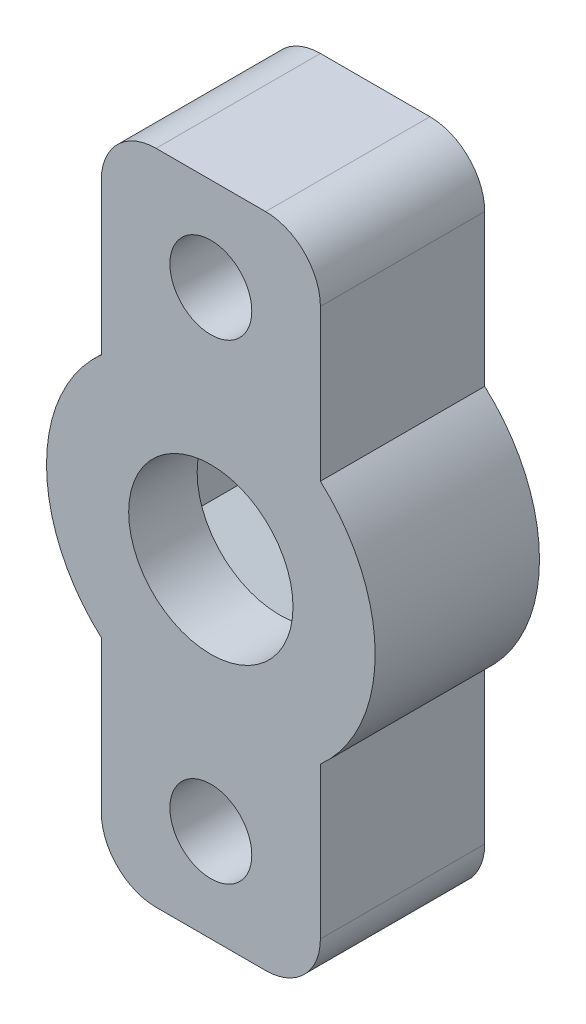
ISO-10303-21;
HEADER;
FILE_DESCRIPTION(('STEP AP214'),'2;1');
FILE_NAME('part.step','',(''),(''),'','','');
FILE_SCHEMA(('AUTOMOTIVE_DESIGN { 1 0 10303 214 1 1 1 1 }'));
ENDSEC;
DATA;
#1=APPLICATION_CONTEXT('core data for automotive mechanical design processes');
#2=APPLICATION_PROTOCOL_DEFINITION('international standard','automotive_design',2000,#1);
#3=PRODUCT_CONTEXT('',#1,'mechanical');
#4=PRODUCT('Part','Part','',(#3));
#5=PRODUCT_RELATED_PRODUCT_CATEGORY('part','',(#4));
#6=PRODUCT_DEFINITION_FORMATION('','',#4);
#7=PRODUCT_DEFINITION_CONTEXT('part definition',#1,'design');
#8=PRODUCT_DEFINITION('design','',#6,#7);
#9=PRODUCT_DEFINITION_SHAPE('','',#8);
#10=(LENGTH_UNIT() NAMED_UNIT(*) SI_UNIT(.MILLI.,.METRE.));
#11=(NAMED_UNIT(*) PLANE_ANGLE_UNIT() SI_UNIT($,.RADIAN.));
#12=(NAMED_UNIT(*) SI_UNIT($,.STERADIAN.) SOLID_ANGLE_UNIT());
#13=UNCERTAINTY_MEASURE_WITH_UNIT(LENGTH_MEASURE(1.E-05),#10,'distance_accuracy_value','');
#14=(GEOMETRIC_REPRESENTATION_CONTEXT(3) GLOBAL_UNCERTAINTY_ASSIGNED_CONTEXT((#13)) GLOBAL_UNIT_ASSIGNED_CONTEXT((#10,
#11,#12)) REPRESENTATION_CONTEXT('',''));
#15=CARTESIAN_POINT('',(0.,0.,0.));
#16=DIRECTION('',(0.,0.,1.));
#17=DIRECTION('',(1.,0.,0.));
#18=AXIS2_PLACEMENT_3D('',#15,#16,#17);
#19=CARTESIAN_POINT('',(2.54,12.7,7.62));
#20=DIRECTION('',(0.,0.,-1.));
#21=DIRECTION('',(-1.,0.,0.));
#22=AXIS2_PLACEMENT_3D('',#19,#20,#21);
#23=CYLINDRICAL_SURFACE('',#22,2.54);
#24=CARTESIAN_POINT('',(2.54,12.7,0.));
#25=DIRECTION('',(0.,0.,1.));
#26=DIRECTION('',(1.,0.,0.));
#27=AXIS2_PLACEMENT_3D('',#24,#25,#26);
#28=CIRCLE('',#27,2.54);
#29=CARTESIAN_POINT('',(5.08,12.7,0.));
#30=VERTEX_POINT('',#29);
#31=CARTESIAN_POINT('',(2.53999999999998,15.24,0.));
#32=VERTEX_POINT('',#31);
#33=EDGE_CURVE('E175',#30,#32,#28,.T.);
#34=ORIENTED_EDGE('',*,*,#33,.T.);
#35=DIRECTION('',(0.,0.,-1.));
#36=VECTOR('',#35,1.);
#37=CARTESIAN_POINT('',(2.53999999999998,15.24,7.62));
#38=LINE('',#37,#36);
#39=CARTESIAN_POINT('',(2.53999999999998,15.24,7.62));
#40=VERTEX_POINT('',#39);
#41=EDGE_CURVE('E11',#40,#32,#38,.T.);
#42=ORIENTED_EDGE('',*,*,#41,.F.);
#43=CARTESIAN_POINT('',(2.54,12.7,7.62));
#44=DIRECTION('',(0.,0.,1.));
#45=DIRECTION('',(1.,0.,0.));
#46=AXIS2_PLACEMENT_3D('',#43,#44,#45);
#47=CIRCLE('',#46,2.54);
#48=CARTESIAN_POINT('',(5.08,12.7,7.62));
#49=VERTEX_POINT('',#48);
#50=EDGE_CURVE('E211',#49,#40,#47,.T.);
#51=ORIENTED_EDGE('',*,*,#50,.F.);
#52=DIRECTION('',(0.,0.,-1.));
#53=VECTOR('',#52,1.);
#54=CARTESIAN_POINT('',(5.08,12.7,7.62));
#55=LINE('',#54,#53);
#56=EDGE_CURVE('E171',#49,#30,#55,.T.);
#57=ORIENTED_EDGE('',*,*,#56,.T.);
#58=EDGE_LOOP('',(#34,#42,#51,#57));
#59=FACE_BOUND('',#58,.T.);
#60=ADVANCED_FACE('F38',(#59),#23,.T.);
#61=CARTESIAN_POINT('',(-2.53999999999998,15.24,7.62));
#62=DIRECTION('',(0.,-1.,0.));
#63=DIRECTION('',(0.,0.,-1.));
#64=AXIS2_PLACEMENT_3D('',#61,#62,#63);
#65=PLANE('',#64);
#66=DIRECTION('',(-1.,0.,0.));
#67=VECTOR('',#66,1.);
#68=CARTESIAN_POINT('',(-2.53999999999998,15.24,0.));
#69=LINE('',#68,#67);
#70=CARTESIAN_POINT('',(-2.53999999999998,15.24,0.));
#71=VERTEX_POINT('',#70);
#72=EDGE_CURVE('E179',#32,#71,#69,.T.);
#73=ORIENTED_EDGE('',*,*,#72,.T.);
#74=DIRECTION('',(0.,0.,-1.));
#75=VECTOR('',#74,1.);
#76=CARTESIAN_POINT('',(-2.53999999999998,15.24,7.62));
#77=LINE('',#76,#75);
#78=CARTESIAN_POINT('',(-2.53999999999998,15.24,7.62));
#79=VERTEX_POINT('',#78);
#80=EDGE_CURVE('E46',#79,#71,#77,.T.);
#81=ORIENTED_EDGE('',*,*,#80,.F.);
#82=DIRECTION('',(-1.,0.,0.));
#83=VECTOR('',#82,1.);
#84=CARTESIAN_POINT('',(-2.53999999999998,15.24,7.62));
#85=LINE('',#84,#83);
#86=EDGE_CURVE('E115',#40,#79,#85,.T.);
#87=ORIENTED_EDGE('',*,*,#86,.F.);
#88=ORIENTED_EDGE('',*,*,#41,.T.);
#89=EDGE_LOOP('',(#73,#81,#87,#88));
#90=FACE_BOUND('',#89,.T.);
#91=ADVANCED_FACE('F456',(#90),#65,.F.);
#92=CARTESIAN_POINT('',(-2.54,12.7,7.62));
#93=DIRECTION('',(0.,0.,-1.));
#94=DIRECTION('',(-1.,0.,0.));
#95=AXIS2_PLACEMENT_3D('',#92,#93,#94);
#96=CYLINDRICAL_SURFACE('',#95,2.54);
#97=CARTESIAN_POINT('',(-2.54,12.7,0.));
#98=DIRECTION('',(0.,0.,1.));
#99=DIRECTION('',(1.,0.,0.));
#100=AXIS2_PLACEMENT_3D('',#97,#98,#99);
#101=CIRCLE('',#100,2.54);
#102=CARTESIAN_POINT('',(-5.08,12.7,0.));
#103=VERTEX_POINT('',#102);
#104=EDGE_CURVE('E183',#71,#103,#101,.T.);
#105=ORIENTED_EDGE('',*,*,#104,.T.);
#106=DIRECTION('',(0.,0.,-1.));
#107=VECTOR('',#106,1.);
#108=CARTESIAN_POINT('',(-5.08,12.7,7.62));
#109=LINE('',#108,#107);
#110=CARTESIAN_POINT('',(-5.08,12.7,7.62));
#111=VERTEX_POINT('',#110);
#112=EDGE_CURVE('E238',#111,#103,#109,.T.);
#113=ORIENTED_EDGE('',*,*,#112,.F.);
#114=CARTESIAN_POINT('',(-2.54,12.7,7.62));
#115=DIRECTION('',(0.,0.,1.));
#116=DIRECTION('',(1.,0.,0.));
#117=AXIS2_PLACEMENT_3D('',#114,#115,#116);
#118=CIRCLE('',#117,2.54);
#119=EDGE_CURVE('E248',#79,#111,#118,.T.);
#120=ORIENTED_EDGE('',*,*,#119,.F.);
#121=ORIENTED_EDGE('',*,*,#80,.T.);
#122=EDGE_LOOP('',(#105,#113,#120,#121));
#123=FACE_BOUND('',#122,.T.);
#124=ADVANCED_FACE('F246',(#123),#96,.T.);
#125=CARTESIAN_POINT('',(-5.08,12.7,7.62));
#126=DIRECTION('',(1.,0.,0.));
#127=DIRECTION('',(0.,1.,0.));
#128=AXIS2_PLACEMENT_3D('',#125,#126,#127);
#129=PLANE('',#128);
#130=DIRECTION('',(0.,-1.,0.));
#131=VECTOR('',#130,1.);
#132=CARTESIAN_POINT('',(-5.08,12.7,0.));
#133=LINE('',#132,#131);
#134=CARTESIAN_POINT('',(-5.08,5.67961266284947,0.));
#135=VERTEX_POINT('',#134);
#136=EDGE_CURVE('E186',#103,#135,#133,.T.);
#137=ORIENTED_EDGE('',*,*,#136,.T.);
#138=DIRECTION('',(0.,0.,-1.));
#139=VECTOR('',#138,1.);
#140=CARTESIAN_POINT('',(-5.08,5.67961266284947,7.62));
#141=LINE('',#140,#139);
#142=CARTESIAN_POINT('',(-5.08,5.67961266284947,7.62));
#143=VERTEX_POINT('',#142);
#144=EDGE_CURVE('E234',#143,#135,#141,.T.);
#145=ORIENTED_EDGE('',*,*,#144,.F.);
#146=DIRECTION('',(0.,-1.,0.));
#147=VECTOR('',#146,1.);
#148=CARTESIAN_POINT('',(-5.08,12.7,7.62));
#149=LINE('',#148,#147);
#150=EDGE_CURVE('E267',#111,#143,#149,.T.);
#151=ORIENTED_EDGE('',*,*,#150,.F.);
#152=ORIENTED_EDGE('',*,*,#112,.T.);
#153=EDGE_LOOP('',(#137,#145,#151,#152));
#154=FACE_BOUND('',#153,.T.);
#155=ADVANCED_FACE('F257',(#154),#129,.F.);
#156=CARTESIAN_POINT('',(0.,0.,7.62));
#157=DIRECTION('',(0.,0.,-1.));
#158=DIRECTION('',(-1.,0.,0.));
#159=AXIS2_PLACEMENT_3D('',#156,#157,#158);
#160=CYLINDRICAL_SURFACE('',#159,7.62);
#161=CARTESIAN_POINT('',(0.,0.,0.));
#162=DIRECTION('',(0.,0.,1.));
#163=DIRECTION('',(1.,0.,0.));
#164=AXIS2_PLACEMENT_3D('',#161,#162,#163);
#165=CIRCLE('',#164,7.62);
#166=CARTESIAN_POINT('',(-5.07999999999999,-5.67961266284947,0.));
#167=VERTEX_POINT('',#166);
#168=EDGE_CURVE('E189',#135,#167,#165,.T.);
#169=ORIENTED_EDGE('',*,*,#168,.T.);
#170=DIRECTION('',(0.,0.,-1.));
#171=VECTOR('',#170,1.);
#172=CARTESIAN_POINT('',(-5.07999999999999,-5.67961266284947,7.62));
#173=LINE('',#172,#171);
#174=CARTESIAN_POINT('',(-5.07999999999999,-5.67961266284947,7.62));
#175=VERTEX_POINT('',#174);
#176=EDGE_CURVE('E230',#175,#167,#173,.T.);
#177=ORIENTED_EDGE('',*,*,#176,.F.);
#178=CARTESIAN_POINT('',(0.,0.,7.62));
#179=DIRECTION('',(0.,0.,1.));
#180=DIRECTION('',(1.,0.,0.));
#181=AXIS2_PLACEMENT_3D('',#178,#179,#180);
#182=CIRCLE('',#181,7.62);
#183=EDGE_CURVE('E263',#143,#175,#182,.T.);
#184=ORIENTED_EDGE('',*,*,#183,.F.);
#185=ORIENTED_EDGE('',*,*,#144,.T.);
#186=EDGE_LOOP('',(#169,#177,#184,#185));
#187=FACE_BOUND('',#186,.T.);
#188=ADVANCED_FACE('F261',(#187),#160,.T.);
#189=CARTESIAN_POINT('',(-5.08,-12.7,7.62));
#190=DIRECTION('',(1.,0.,0.));
#191=DIRECTION('',(0.,1.,0.));
#192=AXIS2_PLACEMENT_3D('',#189,#190,#191);
#193=PLANE('',#192);
#194=DIRECTION('',(0.,-1.,0.));
#195=VECTOR('',#194,1.);
#196=CARTESIAN_POINT('',(-5.08,-12.7,0.));
#197=LINE('',#196,#195);
#198=CARTESIAN_POINT('',(-5.08,-12.7,0.));
#199=VERTEX_POINT('',#198);
#200=EDGE_CURVE('E192',#167,#199,#197,.T.);
#201=ORIENTED_EDGE('',*,*,#200,.T.);
#202=DIRECTION('',(0.,0.,-1.));
#203=VECTOR('',#202,1.);
#204=CARTESIAN_POINT('',(-5.08,-12.7,7.62));
#205=LINE('',#204,#203);
#206=CARTESIAN_POINT('',(-5.08,-12.7,7.62));
#207=VERTEX_POINT('',#206);
#208=EDGE_CURVE('E226',#207,#199,#205,.T.);
#209=ORIENTED_EDGE('',*,*,#208,.F.);
#210=DIRECTION('',(0.,-1.,0.));
#211=VECTOR('',#210,1.);
#212=CARTESIAN_POINT('',(-5.08,-12.7,7.62));
#213=LINE('',#212,#211);
#214=EDGE_CURVE('E266',#175,#207,#213,.T.);
#215=ORIENTED_EDGE('',*,*,#214,.F.);
#216=ORIENTED_EDGE('',*,*,#176,.T.);
#217=EDGE_LOOP('',(#201,#209,#215,#216));
#218=FACE_BOUND('',#217,.T.);
#219=ADVANCED_FACE('F469',(#218),#193,.F.);
#220=CARTESIAN_POINT('',(-2.54,-12.7,7.62));
#221=DIRECTION('',(0.,0.,-1.));
#222=DIRECTION('',(-1.,0.,0.));
#223=AXIS2_PLACEMENT_3D('',#220,#221,#222);
#224=CYLINDRICAL_SURFACE('',#223,2.54);
#225=CARTESIAN_POINT('',(-2.54,-12.7,0.));
#226=DIRECTION('',(0.,0.,1.));
#227=DIRECTION('',(-1.,0.,0.));
#228=AXIS2_PLACEMENT_3D('',#225,#226,#227);
#229=CIRCLE('',#228,2.54);
#230=CARTESIAN_POINT('',(-2.53999999999998,-15.24,0.));
#231=VERTEX_POINT('',#230);
#232=EDGE_CURVE('E195',#199,#231,#229,.T.);
#233=ORIENTED_EDGE('',*,*,#232,.T.);
#234=DIRECTION('',(0.,0.,-1.));
#235=VECTOR('',#234,1.);
#236=CARTESIAN_POINT('',(-2.53999999999998,-15.24,7.62));
#237=LINE('',#236,#235);
#238=CARTESIAN_POINT('',(-2.53999999999998,-15.24,7.62));
#239=VERTEX_POINT('',#238);
#240=EDGE_CURVE('E222',#239,#231,#237,.T.);
#241=ORIENTED_EDGE('',*,*,#240,.F.);
#242=CARTESIAN_POINT('',(-2.54,-12.7,7.62));
#243=DIRECTION('',(0.,0.,1.));
#244=DIRECTION('',(-1.,0.,0.));
#245=AXIS2_PLACEMENT_3D('',#242,#243,#244);
#246=CIRCLE('',#245,2.54);
#247=EDGE_CURVE('E271',#207,#239,#246,.T.);
#248=ORIENTED_EDGE('',*,*,#247,.F.);
#249=ORIENTED_EDGE('',*,*,#208,.T.);
#250=EDGE_LOOP('',(#233,#241,#248,#249));
#251=FACE_BOUND('',#250,.T.);
#252=ADVANCED_FACE('F472',(#251),#224,.T.);
#253=CARTESIAN_POINT('',(-2.53999999999998,-15.24,7.62));
#254=DIRECTION('',(0.,1.,0.));
#255=DIRECTION('',(0.,0.,1.));
#256=AXIS2_PLACEMENT_3D('',#253,#254,#255);
#257=PLANE('',#256);
#258=DIRECTION('',(1.,0.,0.));
#259=VECTOR('',#258,1.);
#260=CARTESIAN_POINT('',(-2.53999999999998,-15.24,0.));
#261=LINE('',#260,#259);
#262=CARTESIAN_POINT('',(2.53999999999998,-15.24,0.));
#263=VERTEX_POINT('',#262);
#264=EDGE_CURVE('E198',#231,#263,#261,.T.);
#265=ORIENTED_EDGE('',*,*,#264,.T.);
#266=DIRECTION('',(0.,0.,-1.));
#267=VECTOR('',#266,1.);
#268=CARTESIAN_POINT('',(2.53999999999998,-15.24,7.62));
#269=LINE('',#268,#267);
#270=CARTESIAN_POINT('',(2.53999999999998,-15.24,7.62));
#271=VERTEX_POINT('',#270);
#272=EDGE_CURVE('E218',#271,#263,#269,.T.);
#273=ORIENTED_EDGE('',*,*,#272,.F.);
#274=DIRECTION('',(1.,0.,0.));
#275=VECTOR('',#274,1.);
#276=CARTESIAN_POINT('',(-2.53999999999998,-15.24,7.62));
#277=LINE('',#276,#275);
#278=EDGE_CURVE('E278',#239,#271,#277,.T.);
#279=ORIENTED_EDGE('',*,*,#278,.F.);
#280=ORIENTED_EDGE('',*,*,#240,.T.);
#281=EDGE_LOOP('',(#265,#273,#279,#280));
#282=FACE_BOUND('',#281,.T.);
#283=ADVANCED_FACE('F286',(#282),#257,.F.);
#284=CARTESIAN_POINT('',(2.54,-12.7,7.62));
#285=DIRECTION('',(0.,0.,-1.));
#286=DIRECTION('',(-1.,0.,0.));
#287=AXIS2_PLACEMENT_3D('',#284,#285,#286);
#288=CYLINDRICAL_SURFACE('',#287,2.54);
#289=CARTESIAN_POINT('',(2.54,-12.7,0.));
#290=DIRECTION('',(0.,0.,1.));
#291=DIRECTION('',(-1.,0.,0.));
#292=AXIS2_PLACEMENT_3D('',#289,#290,#291);
#293=CIRCLE('',#292,2.54);
#294=CARTESIAN_POINT('',(5.08,-12.7,0.));
#295=VERTEX_POINT('',#294);
#296=EDGE_CURVE('E201',#263,#295,#293,.T.);
#297=ORIENTED_EDGE('',*,*,#296,.T.);
#298=DIRECTION('',(0.,0.,-1.));
#299=VECTOR('',#298,1.);
#300=CARTESIAN_POINT('',(5.08,-12.7,7.62));
#301=LINE('',#300,#299);
#302=CARTESIAN_POINT('',(5.08,-12.7,7.62));
#303=VERTEX_POINT('',#302);
#304=EDGE_CURVE('E164',#303,#295,#301,.T.);
#305=ORIENTED_EDGE('',*,*,#304,.F.);
#306=CARTESIAN_POINT('',(2.54,-12.7,7.62));
#307=DIRECTION('',(0.,0.,1.));
#308=DIRECTION('',(-1.,0.,0.));
#309=AXIS2_PLACEMENT_3D('',#306,#307,#308);
#310=CIRCLE('',#309,2.54);
#311=EDGE_CURVE('E150',#271,#303,#310,.T.);
#312=ORIENTED_EDGE('',*,*,#311,.F.);
#313=ORIENTED_EDGE('',*,*,#272,.T.);
#314=EDGE_LOOP('',(#297,#305,#312,#313));
#315=FACE_BOUND('',#314,.T.);
#316=ADVANCED_FACE('F290',(#315),#288,.T.);
#317=CARTESIAN_POINT('',(5.08,-12.7,7.62));
#318=DIRECTION('',(-1.,0.,0.));
#319=DIRECTION('',(0.,-1.,0.));
#320=AXIS2_PLACEMENT_3D('',#317,#318,#319);
#321=PLANE('',#320);
#322=DIRECTION('',(0.,1.,0.));
#323=VECTOR('',#322,1.);
#324=CARTESIAN_POINT('',(5.08,-12.7,0.));
#325=LINE('',#324,#323);
#326=CARTESIAN_POINT('',(5.08,-5.67961266284946,0.));
#327=VERTEX_POINT('',#326);
#328=EDGE_CURVE('E160',#295,#327,#325,.T.);
#329=ORIENTED_EDGE('',*,*,#328,.T.);
#330=DIRECTION('',(0.,0.,-1.));
#331=VECTOR('',#330,1.);
#332=CARTESIAN_POINT('',(5.08,-5.67961266284946,7.62));
#333=LINE('',#332,#331);
#334=CARTESIAN_POINT('',(5.08,-5.67961266284946,7.62));
#335=VERTEX_POINT('',#334);
#336=EDGE_CURVE('E157',#335,#327,#333,.T.);
#337=ORIENTED_EDGE('',*,*,#336,.F.);
#338=DIRECTION('',(0.,1.,0.));
#339=VECTOR('',#338,1.);
#340=CARTESIAN_POINT('',(5.08,-12.7,7.62));
#341=LINE('',#340,#339);
#342=EDGE_CURVE('E143',#303,#335,#341,.T.);
#343=ORIENTED_EDGE('',*,*,#342,.F.);
#344=ORIENTED_EDGE('',*,*,#304,.T.);
#345=EDGE_LOOP('',(#329,#337,#343,#344));
#346=FACE_BOUND('',#345,.T.);
#347=ADVANCED_FACE('F158',(#346),#321,.F.);
#348=CARTESIAN_POINT('',(0.,0.,7.62));
#349=DIRECTION('',(0.,0.,-1.));
#350=DIRECTION('',(-1.,0.,0.));
#351=AXIS2_PLACEMENT_3D('',#348,#349,#350);
#352=CYLINDRICAL_SURFACE('',#351,7.62);
#353=CARTESIAN_POINT('',(0.,0.,0.));
#354=DIRECTION('',(0.,0.,1.));
#355=DIRECTION('',(1.,0.,0.));
#356=AXIS2_PLACEMENT_3D('',#353,#354,#355);
#357=CIRCLE('',#356,7.62);
#358=CARTESIAN_POINT('',(5.08,5.67961266284946,0.));
#359=VERTEX_POINT('',#358);
#360=EDGE_CURVE('E206',#327,#359,#357,.T.);
#361=ORIENTED_EDGE('',*,*,#360,.T.);
#362=DIRECTION('',(0.,0.,-1.));
#363=VECTOR('',#362,1.);
#364=CARTESIAN_POINT('',(5.08,5.67961266284946,7.62));
#365=LINE('',#364,#363);
#366=CARTESIAN_POINT('',(5.08,5.67961266284946,7.62));
#367=VERTEX_POINT('',#366);
#368=EDGE_CURVE('E165',#367,#359,#365,.T.);
#369=ORIENTED_EDGE('',*,*,#368,.F.);
#370=CARTESIAN_POINT('',(0.,0.,7.62));
#371=DIRECTION('',(0.,0.,1.));
#372=DIRECTION('',(1.,0.,0.));
#373=AXIS2_PLACEMENT_3D('',#370,#371,#372);
#374=CIRCLE('',#373,7.62);
#375=EDGE_CURVE('E147',#335,#367,#374,.T.);
#376=ORIENTED_EDGE('',*,*,#375,.F.);
#377=ORIENTED_EDGE('',*,*,#336,.T.);
#378=EDGE_LOOP('',(#361,#369,#376,#377));
#379=FACE_BOUND('',#378,.T.);
#380=ADVANCED_FACE('F167',(#379),#352,.T.);
#381=CARTESIAN_POINT('',(5.08,12.7,7.62));
#382=DIRECTION('',(-1.,0.,0.));
#383=DIRECTION('',(0.,-1.,0.));
#384=AXIS2_PLACEMENT_3D('',#381,#382,#383);
#385=PLANE('',#384);
#386=DIRECTION('',(0.,1.,0.));
#387=VECTOR('',#386,1.);
#388=CARTESIAN_POINT('',(5.08,12.7,0.));
#389=LINE('',#388,#387);
#390=EDGE_CURVE('E107',#359,#30,#389,.T.);
#391=ORIENTED_EDGE('',*,*,#390,.T.);
#392=ORIENTED_EDGE('',*,*,#56,.F.);
#393=DIRECTION('',(0.,1.,0.));
#394=VECTOR('',#393,1.);
#395=CARTESIAN_POINT('',(5.08,12.7,7.62));
#396=LINE('',#395,#394);
#397=EDGE_CURVE('E62',#367,#49,#396,.T.);
#398=ORIENTED_EDGE('',*,*,#397,.F.);
#399=ORIENTED_EDGE('',*,*,#368,.T.);
#400=EDGE_LOOP('',(#391,#392,#398,#399));
#401=FACE_BOUND('',#400,.T.);
#402=ADVANCED_FACE('F291',(#401),#385,.F.);
#403=CARTESIAN_POINT('',(2.54,12.7,7.62));
#404=DIRECTION('',(0.,0.,1.));
#405=DIRECTION('',(1.,0.,0.));
#406=AXIS2_PLACEMENT_3D('',#403,#404,#405);
#407=PLANE('',#406);
#408=CARTESIAN_POINT('',(0.,10.922,7.62));
#409=DIRECTION('',(0.,0.,1.));
#410=DIRECTION('',(1.,0.,0.));
#411=AXIS2_PLACEMENT_3D('',#408,#409,#410);
#412=CIRCLE('',#411,1.89865);
#413=CARTESIAN_POINT('',(1.89865,10.922,7.62));
#414=VERTEX_POINT('',#413);
#415=EDGE_CURVE('E384',#414,#414,#412,.T.);
#416=ORIENTED_EDGE('',*,*,#415,.F.);
#417=EDGE_LOOP('',(#416));
#418=FACE_BOUND('',#417,.T.);
#419=CARTESIAN_POINT('',(0.,-10.922,7.62));
#420=DIRECTION('',(0.,0.,1.));
#421=DIRECTION('',(1.,0.,0.));
#422=AXIS2_PLACEMENT_3D('',#419,#420,#421);
#423=CIRCLE('',#422,1.89865);
#424=CARTESIAN_POINT('',(1.89865,-10.922,7.62));
#425=VERTEX_POINT('',#424);
#426=EDGE_CURVE('E376',#425,#425,#423,.T.);
#427=ORIENTED_EDGE('',*,*,#426,.F.);
#428=EDGE_LOOP('',(#427));
#429=FACE_BOUND('',#428,.T.);
#430=CARTESIAN_POINT('',(0.,0.,7.62));
#431=DIRECTION('',(0.,0.,1.));
#432=DIRECTION('',(1.,0.,0.));
#433=AXIS2_PLACEMENT_3D('',#430,#431,#432);
#434=CIRCLE('',#433,3.81);
#435=CARTESIAN_POINT('',(-3.81,0.,7.62));
#436=VERTEX_POINT('',#435);
#437=EDGE_CURVE('E346',#436,#436,#434,.T.);
#438=ORIENTED_EDGE('',*,*,#437,.F.);
#439=EDGE_LOOP('',(#438));
#440=FACE_BOUND('',#439,.T.);
#441=ORIENTED_EDGE('',*,*,#50,.T.);
#442=ORIENTED_EDGE('',*,*,#86,.T.);
#443=ORIENTED_EDGE('',*,*,#119,.T.);
#444=ORIENTED_EDGE('',*,*,#150,.T.);
#445=ORIENTED_EDGE('',*,*,#183,.T.);
#446=ORIENTED_EDGE('',*,*,#214,.T.);
#447=ORIENTED_EDGE('',*,*,#247,.T.);
#448=ORIENTED_EDGE('',*,*,#278,.T.);
#449=ORIENTED_EDGE('',*,*,#311,.T.);
#450=ORIENTED_EDGE('',*,*,#342,.T.);
#451=ORIENTED_EDGE('',*,*,#375,.T.);
#452=ORIENTED_EDGE('',*,*,#397,.T.);
#453=EDGE_LOOP('',(#441,#442,#443,#444,#445,#446,#447,#448,#449,#450,#451,#452));
#454=FACE_BOUND('',#453,.T.);
#455=ADVANCED_FACE('F145',(#418,#429,#440,#454),#407,.T.);
#456=CARTESIAN_POINT('',(2.54,12.7,0.));
#457=DIRECTION('',(0.,0.,1.));
#458=DIRECTION('',(1.,0.,0.));
#459=AXIS2_PLACEMENT_3D('',#456,#457,#458);
#460=PLANE('',#459);
#461=CARTESIAN_POINT('',(0.,10.922,0.));
#462=DIRECTION('',(0.,0.,-1.));
#463=DIRECTION('',(-1.,0.,0.));
#464=AXIS2_PLACEMENT_3D('',#461,#462,#463);
#465=CIRCLE('',#464,1.89865);
#466=CARTESIAN_POINT('',(-1.89865,10.922,0.));
#467=VERTEX_POINT('',#466);
#468=EDGE_CURVE('E388',#467,#467,#465,.T.);
#469=ORIENTED_EDGE('',*,*,#468,.F.);
#470=EDGE_LOOP('',(#469));
#471=FACE_BOUND('',#470,.T.);
#472=CARTESIAN_POINT('',(0.,-10.922,0.));
#473=DIRECTION('',(0.,0.,-1.));
#474=DIRECTION('',(-1.,0.,0.));
#475=AXIS2_PLACEMENT_3D('',#472,#473,#474);
#476=CIRCLE('',#475,1.89865);
#477=CARTESIAN_POINT('',(-1.89865,-10.922,0.));
#478=VERTEX_POINT('',#477);
#479=EDGE_CURVE('E380',#478,#478,#476,.T.);
#480=ORIENTED_EDGE('',*,*,#479,.F.);
#481=EDGE_LOOP('',(#480));
#482=FACE_BOUND('',#481,.T.);
#483=DIRECTION('',(0.866025403784439,0.499999999999999,0.));
#484=VECTOR('',#483,1.);
#485=CARTESIAN_POINT('',(-5.55625,3.20790243318486,0.));
#486=LINE('',#485,#484);
#487=CARTESIAN_POINT('',(-5.55625,3.20790243318486,0.));
#488=VERTEX_POINT('',#487);
#489=CARTESIAN_POINT('',(0.,6.41580486636971,0.));
#490=VERTEX_POINT('',#489);
#491=EDGE_CURVE('E340',#488,#490,#486,.T.);
#492=ORIENTED_EDGE('',*,*,#491,.F.);
#493=DIRECTION('',(0.,1.,0.));
#494=VECTOR('',#493,1.);
#495=CARTESIAN_POINT('',(-5.55625000000004,-3.20790243318479,0.));
#496=LINE('',#495,#494);
#497=CARTESIAN_POINT('',(-5.55625000000004,-3.20790243318479,0.));
#498=VERTEX_POINT('',#497);
#499=EDGE_CURVE('E53',#498,#488,#496,.T.);
#500=ORIENTED_EDGE('',*,*,#499,.F.);
#501=DIRECTION('',(-0.866025403784433,0.500000000000009,0.));
#502=VECTOR('',#501,1.);
#503=CARTESIAN_POINT('',(0.,-6.41580486636971,0.));
#504=LINE('',#503,#502);
#505=CARTESIAN_POINT('',(0.,-6.41580486636971,0.));
#506=VERTEX_POINT('',#505);
#507=EDGE_CURVE('E323',#506,#498,#504,.T.);
#508=ORIENTED_EDGE('',*,*,#507,.F.);
#509=DIRECTION('',(-0.866025403784443,-0.499999999999993,0.));
#510=VECTOR('',#509,1.);
#511=CARTESIAN_POINT('',(5.55624999999998,-3.2079024331849,0.));
#512=LINE('',#511,#510);
#513=CARTESIAN_POINT('',(5.55624999999998,-3.2079024331849,0.));
#514=VERTEX_POINT('',#513);
#515=EDGE_CURVE('E328',#514,#506,#512,.T.);
#516=ORIENTED_EDGE('',*,*,#515,.F.);
#517=DIRECTION('',(0.,-1.,0.));
#518=VECTOR('',#517,1.);
#519=CARTESIAN_POINT('',(5.55625000000001,3.20790243318483,0.));
#520=LINE('',#519,#518);
#521=CARTESIAN_POINT('',(5.55625000000001,3.20790243318483,0.));
#522=VERTEX_POINT('',#521);
#523=EDGE_CURVE('E332',#522,#514,#520,.T.);
#524=ORIENTED_EDGE('',*,*,#523,.F.);
#525=DIRECTION('',(0.866025403784437,-0.500000000000003,0.));
#526=VECTOR('',#525,1.);
#527=CARTESIAN_POINT('',(0.,6.41580486636971,0.));
#528=LINE('',#527,#526);
#529=EDGE_CURVE('E336',#490,#522,#528,.T.);
#530=ORIENTED_EDGE('',*,*,#529,.F.);
#531=EDGE_LOOP('',(#492,#500,#508,#516,#524,#530));
#532=FACE_BOUND('',#531,.T.);
#533=ORIENTED_EDGE('',*,*,#33,.F.);
#534=ORIENTED_EDGE('',*,*,#390,.F.);
#535=ORIENTED_EDGE('',*,*,#360,.F.);
#536=ORIENTED_EDGE('',*,*,#328,.F.);
#537=ORIENTED_EDGE('',*,*,#296,.F.);
#538=ORIENTED_EDGE('',*,*,#264,.F.);
#539=ORIENTED_EDGE('',*,*,#232,.F.);
#540=ORIENTED_EDGE('',*,*,#200,.F.);
#541=ORIENTED_EDGE('',*,*,#168,.F.);
#542=ORIENTED_EDGE('',*,*,#136,.F.);
#543=ORIENTED_EDGE('',*,*,#104,.F.);
#544=ORIENTED_EDGE('',*,*,#72,.F.);
#545=EDGE_LOOP('',(#533,#534,#535,#536,#537,#538,#539,#540,#541,#542,#543,#544));
#546=FACE_BOUND('',#545,.T.);
#547=ADVANCED_FACE('F252',(#471,#482,#532,#546),#460,.F.);
#548=CARTESIAN_POINT('',(-5.55625000000004,-3.20790243318479,4.445));
#549=DIRECTION('',(-1.,0.,0.));
#550=DIRECTION('',(0.,-1.,0.));
#551=AXIS2_PLACEMENT_3D('',#548,#549,#550);
#552=PLANE('',#551);
#553=ORIENTED_EDGE('',*,*,#499,.T.);
#554=DIRECTION('',(0.,0.,-1.));
#555=VECTOR('',#554,1.);
#556=CARTESIAN_POINT('',(-5.55625,3.20790243318486,4.445));
#557=LINE('',#556,#555);
#558=CARTESIAN_POINT('',(-5.55625,3.20790243318486,4.445));
#559=VERTEX_POINT('',#558);
#560=EDGE_CURVE('E300',#559,#488,#557,.T.);
#561=ORIENTED_EDGE('',*,*,#560,.F.);
#562=DIRECTION('',(0.,1.,0.));
#563=VECTOR('',#562,1.);
#564=CARTESIAN_POINT('',(-5.55625000000004,-3.20790243318479,4.445));
#565=LINE('',#564,#563);
#566=CARTESIAN_POINT('',(-5.55625000000004,-3.20790243318479,4.445));
#567=VERTEX_POINT('',#566);
#568=EDGE_CURVE('E327',#567,#559,#565,.T.);
#569=ORIENTED_EDGE('',*,*,#568,.F.);
#570=DIRECTION('',(0.,0.,-1.));
#571=VECTOR('',#570,1.);
#572=CARTESIAN_POINT('',(-5.55625000000004,-3.20790243318479,4.445));
#573=LINE('',#572,#571);
#574=EDGE_CURVE('E180',#567,#498,#573,.T.);
#575=ORIENTED_EDGE('',*,*,#574,.T.);
#576=EDGE_LOOP('',(#553,#561,#569,#575));
#577=FACE_BOUND('',#576,.T.);
#578=ADVANCED_FACE('F397',(#577),#552,.F.);
#579=CARTESIAN_POINT('',(0.,-6.41580486636971,4.445));
#580=DIRECTION('',(-0.500000000000009,-0.866025403784433,0.));
#581=DIRECTION('',(0.866025403784433,-0.500000000000009,0.));
#582=AXIS2_PLACEMENT_3D('',#579,#580,#581);
#583=PLANE('',#582);
#584=ORIENTED_EDGE('',*,*,#507,.T.);
#585=ORIENTED_EDGE('',*,*,#574,.F.);
#586=DIRECTION('',(-0.866025403784433,0.500000000000009,0.));
#587=VECTOR('',#586,1.);
#588=CARTESIAN_POINT('',(0.,-6.41580486636971,4.445));
#589=LINE('',#588,#587);
#590=CARTESIAN_POINT('',(0.,-6.41580486636971,4.445));
#591=VERTEX_POINT('',#590);
#592=EDGE_CURVE('E305',#591,#567,#589,.T.);
#593=ORIENTED_EDGE('',*,*,#592,.F.);
#594=DIRECTION('',(0.,0.,-1.));
#595=VECTOR('',#594,1.);
#596=CARTESIAN_POINT('',(0.,-6.41580486636971,4.445));
#597=LINE('',#596,#595);
#598=EDGE_CURVE('E317',#591,#506,#597,.T.);
#599=ORIENTED_EDGE('',*,*,#598,.T.);
#600=EDGE_LOOP('',(#584,#585,#593,#599));
#601=FACE_BOUND('',#600,.T.);
#602=ADVANCED_FACE('F438',(#601),#583,.F.);
#603=CARTESIAN_POINT('',(5.55624999999998,-3.2079024331849,4.445));
#604=DIRECTION('',(0.499999999999993,-0.866025403784443,0.));
#605=DIRECTION('',(0.866025403784443,0.499999999999993,0.));
#606=AXIS2_PLACEMENT_3D('',#603,#604,#605);
#607=PLANE('',#606);
#608=ORIENTED_EDGE('',*,*,#515,.T.);
#609=ORIENTED_EDGE('',*,*,#598,.F.);
#610=DIRECTION('',(-0.866025403784443,-0.499999999999993,0.));
#611=VECTOR('',#610,1.);
#612=CARTESIAN_POINT('',(5.55624999999998,-3.2079024331849,4.445));
#613=LINE('',#612,#611);
#614=CARTESIAN_POINT('',(5.55624999999998,-3.2079024331849,4.445));
#615=VERTEX_POINT('',#614);
#616=EDGE_CURVE('E350',#615,#591,#613,.T.);
#617=ORIENTED_EDGE('',*,*,#616,.F.);
#618=DIRECTION('',(0.,0.,-1.));
#619=VECTOR('',#618,1.);
#620=CARTESIAN_POINT('',(5.55624999999998,-3.2079024331849,4.445));
#621=LINE('',#620,#619);
#622=EDGE_CURVE('E313',#615,#514,#621,.T.);
#623=ORIENTED_EDGE('',*,*,#622,.T.);
#624=EDGE_LOOP('',(#608,#609,#617,#623));
#625=FACE_BOUND('',#624,.T.);
#626=ADVANCED_FACE('F442',(#625),#607,.F.);
#627=CARTESIAN_POINT('',(5.55625000000001,3.20790243318483,4.445));
#628=DIRECTION('',(1.,0.,0.));
#629=DIRECTION('',(0.,1.,0.));
#630=AXIS2_PLACEMENT_3D('',#627,#628,#629);
#631=PLANE('',#630);
#632=ORIENTED_EDGE('',*,*,#523,.T.);
#633=ORIENTED_EDGE('',*,*,#622,.F.);
#634=DIRECTION('',(0.,-1.,0.));
#635=VECTOR('',#634,1.);
#636=CARTESIAN_POINT('',(5.55625000000001,3.20790243318483,4.445));
#637=LINE('',#636,#635);
#638=CARTESIAN_POINT('',(5.55625000000001,3.20790243318483,4.445));
#639=VERTEX_POINT('',#638);
#640=EDGE_CURVE('E354',#639,#615,#637,.T.);
#641=ORIENTED_EDGE('',*,*,#640,.F.);
#642=DIRECTION('',(0.,0.,-1.));
#643=VECTOR('',#642,1.);
#644=CARTESIAN_POINT('',(5.55625000000001,3.20790243318483,4.445));
#645=LINE('',#644,#643);
#646=EDGE_CURVE('E309',#639,#522,#645,.T.);
#647=ORIENTED_EDGE('',*,*,#646,.T.);
#648=EDGE_LOOP('',(#632,#633,#641,#647));
#649=FACE_BOUND('',#648,.T.);
#650=ADVANCED_FACE('F445',(#649),#631,.F.);
#651=CARTESIAN_POINT('',(0.,6.41580486636971,4.445));
#652=DIRECTION('',(0.500000000000003,0.866025403784437,0.));
#653=DIRECTION('',(-0.866025403784437,0.500000000000003,0.));
#654=AXIS2_PLACEMENT_3D('',#651,#652,#653);
#655=PLANE('',#654);
#656=ORIENTED_EDGE('',*,*,#529,.T.);
#657=ORIENTED_EDGE('',*,*,#646,.F.);
#658=DIRECTION('',(0.866025403784437,-0.500000000000003,0.));
#659=VECTOR('',#658,1.);
#660=CARTESIAN_POINT('',(0.,6.41580486636971,4.445));
#661=LINE('',#660,#659);
#662=CARTESIAN_POINT('',(0.,6.41580486636971,4.445));
#663=VERTEX_POINT('',#662);
#664=EDGE_CURVE('E358',#663,#639,#661,.T.);
#665=ORIENTED_EDGE('',*,*,#664,.F.);
#666=DIRECTION('',(0.,0.,-1.));
#667=VECTOR('',#666,1.);
#668=CARTESIAN_POINT('',(0.,6.41580486636971,4.445));
#669=LINE('',#668,#667);
#670=EDGE_CURVE('E304',#663,#490,#669,.T.);
#671=ORIENTED_EDGE('',*,*,#670,.T.);
#672=EDGE_LOOP('',(#656,#657,#665,#671));
#673=FACE_BOUND('',#672,.T.);
#674=ADVANCED_FACE('F446',(#673),#655,.F.);
#675=CARTESIAN_POINT('',(-5.55625,3.20790243318486,4.445));
#676=DIRECTION('',(-0.499999999999999,0.866025403784439,0.));
#677=DIRECTION('',(-0.866025403784439,-0.499999999999999,0.));
#678=AXIS2_PLACEMENT_3D('',#675,#676,#677);
#679=PLANE('',#678);
#680=ORIENTED_EDGE('',*,*,#491,.T.);
#681=ORIENTED_EDGE('',*,*,#670,.F.);
#682=DIRECTION('',(0.866025403784439,0.499999999999999,0.));
#683=VECTOR('',#682,1.);
#684=CARTESIAN_POINT('',(-5.55625,3.20790243318486,4.445));
#685=LINE('',#684,#683);
#686=EDGE_CURVE('E362',#559,#663,#685,.T.);
#687=ORIENTED_EDGE('',*,*,#686,.F.);
#688=ORIENTED_EDGE('',*,*,#560,.T.);
#689=EDGE_LOOP('',(#680,#681,#687,#688));
#690=FACE_BOUND('',#689,.T.);
#691=ADVANCED_FACE('F408',(#690),#679,.F.);
#692=CARTESIAN_POINT('',(0.,0.,4.445));
#693=DIRECTION('',(0.,0.,-1.));
#694=DIRECTION('',(-1.,0.,0.));
#695=AXIS2_PLACEMENT_3D('',#692,#693,#694);
#696=PLANE('',#695);
#697=CARTESIAN_POINT('',(0.,0.,4.445));
#698=DIRECTION('',(0.,0.,-1.));
#699=DIRECTION('',(-1.,0.,0.));
#700=AXIS2_PLACEMENT_3D('',#697,#698,#699);
#701=CIRCLE('',#700,3.81);
#702=CARTESIAN_POINT('',(-3.81,0.,4.445));
#703=VERTEX_POINT('',#702);
#704=EDGE_CURVE('E372',#703,#703,#701,.T.);
#705=ORIENTED_EDGE('',*,*,#704,.F.);
#706=EDGE_LOOP('',(#705));
#707=FACE_BOUND('',#706,.T.);
#708=ORIENTED_EDGE('',*,*,#568,.T.);
#709=ORIENTED_EDGE('',*,*,#686,.T.);
#710=ORIENTED_EDGE('',*,*,#664,.T.);
#711=ORIENTED_EDGE('',*,*,#640,.T.);
#712=ORIENTED_EDGE('',*,*,#616,.T.);
#713=ORIENTED_EDGE('',*,*,#592,.T.);
#714=EDGE_LOOP('',(#708,#709,#710,#711,#712,#713));
#715=FACE_BOUND('',#714,.T.);
#716=ADVANCED_FACE('F440',(#707,#715),#696,.T.);
#717=CARTESIAN_POINT('',(0.,0.,10.541));
#718=DIRECTION('',(0.,0.,-1.));
#719=DIRECTION('',(-1.,0.,0.));
#720=AXIS2_PLACEMENT_3D('',#717,#718,#719);
#721=CYLINDRICAL_SURFACE('',#720,3.81);
#722=CARTESIAN_POINT('',(-3.81,0.,7.62));
#723=CARTESIAN_POINT('',(-3.81,0.,7.58692708333333));
#724=CARTESIAN_POINT('',(-3.81,0.,7.55385416666667));
#725=CARTESIAN_POINT('',(-3.81,0.,7.48770833333333));
#726=CARTESIAN_POINT('',(-3.81,0.,7.45463541666667));
#727=CARTESIAN_POINT('',(-3.81,0.,7.38848958333333));
#728=CARTESIAN_POINT('',(-3.81,0.,7.35541666666667));
#729=CARTESIAN_POINT('',(-3.81,0.,7.28927083333333));
#730=CARTESIAN_POINT('',(-3.81,0.,7.25619791666667));
#731=CARTESIAN_POINT('',(-3.81,0.,7.19005208333333));
#732=CARTESIAN_POINT('',(-3.81,0.,7.15697916666667));
#733=CARTESIAN_POINT('',(-3.81,0.,7.09083333333333));
#734=CARTESIAN_POINT('',(-3.81,0.,7.05776041666667));
#735=CARTESIAN_POINT('',(-3.81,0.,6.99161458333333));
#736=CARTESIAN_POINT('',(-3.81,0.,6.95854166666667));
#737=CARTESIAN_POINT('',(-3.81,0.,6.89239583333333));
#738=CARTESIAN_POINT('',(-3.81,0.,6.85932291666667));
#739=CARTESIAN_POINT('',(-3.81,0.,6.79317708333333));
#740=CARTESIAN_POINT('',(-3.81,0.,6.76010416666667));
#741=CARTESIAN_POINT('',(-3.81,0.,6.69395833333333));
#742=CARTESIAN_POINT('',(-3.81,0.,6.66088541666667));
#743=CARTESIAN_POINT('',(-3.81,0.,6.59473958333333));
#744=CARTESIAN_POINT('',(-3.81,0.,6.56166666666667));
#745=CARTESIAN_POINT('',(-3.81,0.,6.49552083333333));
#746=CARTESIAN_POINT('',(-3.81,0.,6.46244791666667));
#747=CARTESIAN_POINT('',(-3.81,0.,6.39630208333333));
#748=CARTESIAN_POINT('',(-3.81,0.,6.36322916666667));
#749=CARTESIAN_POINT('',(-3.81,0.,6.29708333333333));
#750=CARTESIAN_POINT('',(-3.81,0.,6.26401041666667));
#751=CARTESIAN_POINT('',(-3.81,0.,6.19786458333333));
#752=CARTESIAN_POINT('',(-3.81,0.,6.16479166666667));
#753=CARTESIAN_POINT('',(-3.81,0.,6.09864583333333));
#754=CARTESIAN_POINT('',(-3.81,0.,6.06557291666667));
#755=CARTESIAN_POINT('',(-3.81,0.,5.99942708333333));
#756=CARTESIAN_POINT('',(-3.81,0.,5.96635416666667));
#757=CARTESIAN_POINT('',(-3.81,0.,5.90020833333333));
#758=CARTESIAN_POINT('',(-3.81,0.,5.86713541666667));
#759=CARTESIAN_POINT('',(-3.81,0.,5.80098958333333));
#760=CARTESIAN_POINT('',(-3.81,0.,5.76791666666667));
#761=CARTESIAN_POINT('',(-3.81,0.,5.70177083333333));
#762=CARTESIAN_POINT('',(-3.81,0.,5.66869791666667));
#763=CARTESIAN_POINT('',(-3.81,0.,5.60255208333333));
#764=CARTESIAN_POINT('',(-3.81,0.,5.56947916666667));
#765=CARTESIAN_POINT('',(-3.81,0.,5.50333333333333));
#766=CARTESIAN_POINT('',(-3.81,0.,5.47026041666667));
#767=CARTESIAN_POINT('',(-3.81,0.,5.40411458333333));
#768=CARTESIAN_POINT('',(-3.81,0.,5.37104166666667));
#769=CARTESIAN_POINT('',(-3.81,0.,5.30489583333333));
#770=CARTESIAN_POINT('',(-3.81,0.,5.27182291666667));
#771=CARTESIAN_POINT('',(-3.81,0.,5.20567708333333));
#772=CARTESIAN_POINT('',(-3.81,0.,5.17260416666667));
#773=CARTESIAN_POINT('',(-3.81,0.,5.10645833333333));
#774=CARTESIAN_POINT('',(-3.81,0.,5.07338541666667));
#775=CARTESIAN_POINT('',(-3.81,0.,5.00723958333333));
#776=CARTESIAN_POINT('',(-3.81,0.,4.97416666666667));
#777=CARTESIAN_POINT('',(-3.81,0.,4.90802083333333));
#778=CARTESIAN_POINT('',(-3.81,0.,4.87494791666667));
#779=CARTESIAN_POINT('',(-3.81,0.,4.80880208333333));
#780=CARTESIAN_POINT('',(-3.81,0.,4.77572916666667));
#781=CARTESIAN_POINT('',(-3.81,0.,4.70958333333333));
#782=CARTESIAN_POINT('',(-3.81,0.,4.67651041666667));
#783=CARTESIAN_POINT('',(-3.81,0.,4.61036458333333));
#784=CARTESIAN_POINT('',(-3.81,0.,4.57729166666667));
#785=CARTESIAN_POINT('',(-3.81,0.,4.51114583333333));
#786=CARTESIAN_POINT('',(-3.81,0.,4.47807291666667));
#787=CARTESIAN_POINT('',(-3.81,0.,4.445));
#788=B_SPLINE_CURVE_WITH_KNOTS('',3,(#722,#723,#724,#725,#726,#727,#728,#729,#730,#731,#732,
#733,#734,#735,#736,#737,#738,#739,#740,#741,#742,#743,#744,#745,#746,#747,#748,#749,#750,#751,
#752,#753,#754,#755,#756,#757,#758,#759,#760,#761,#762,#763,#764,#765,#766,#767,#768,#769,#770,
#771,#772,#773,#774,#775,#776,#777,#778,#779,#780,#781,#782,#783,#784,#785,#786,#787),
.UNSPECIFIED.,.F.,.F.,(4,2,2,2,2,2,2,2,2,2,2,2,2,2,2,2,2,2,2,2,2,2,2,2,2,2,2,2,2,2,2,2,4),(0.,
0.0992187500000004,0.198437500000001,0.29765625,0.396875000000001,0.496093750000001,0.5953125,
0.69453125,0.793750000000001,0.892968750000001,0.9921875,1.09140625,1.190625,1.28984375,
1.3890625,1.48828125,1.5875,1.68671875,1.7859375,1.88515625,1.984375,2.08359375,2.1828125,
2.28203125,2.38125,2.48046875,2.5796875,2.67890625,2.778125,2.87734375,2.9765625,3.07578125,
3.175),.UNSPECIFIED.);
#789=EDGE_CURVE('BSEAM503',#436,#703,#788,.T.);
#790=ORIENTED_EDGE('',*,*,#437,.T.);
#791=ORIENTED_EDGE('',*,*,#704,.T.);
#792=ORIENTED_EDGE('',*,*,#789,.T.);
#793=ORIENTED_EDGE('',*,*,#789,.F.);
#794=EDGE_LOOP('',(#790,#792,#791,#793));
#795=FACE_BOUND('',#794,.T.);
#796=ADVANCED_FACE('F503',(#795),#721,.F.);
#797=CARTESIAN_POINT('',(0.,-10.922,0.));
#798=DIRECTION('',(0.,0.,-1.));
#799=DIRECTION('',(-1.,0.,0.));
#800=AXIS2_PLACEMENT_3D('',#797,#798,#799);
#801=CYLINDRICAL_SURFACE('',#800,1.89865);
#802=ORIENTED_EDGE('',*,*,#426,.T.);
#803=EDGE_LOOP('',(#802));
#804=FACE_BOUND('',#803,.T.);
#805=ORIENTED_EDGE('',*,*,#479,.T.);
#806=EDGE_LOOP('',(#805));
#807=FACE_BOUND('',#806,.T.);
#808=ADVANCED_FACE('F507',(#804,#807),#801,.F.);
#809=CARTESIAN_POINT('',(0.,10.922,0.));
#810=DIRECTION('',(0.,0.,-1.));
#811=DIRECTION('',(-1.,0.,0.));
#812=AXIS2_PLACEMENT_3D('',#809,#810,#811);
#813=CYLINDRICAL_SURFACE('',#812,1.89865);
#814=ORIENTED_EDGE('',*,*,#415,.T.);
#815=EDGE_LOOP('',(#814));
#816=FACE_BOUND('',#815,.T.);
#817=ORIENTED_EDGE('',*,*,#468,.T.);
#818=EDGE_LOOP('',(#817));
#819=FACE_BOUND('',#818,.T.);
#820=ADVANCED_FACE('F393',(#816,#819),#813,.F.);
#821=CLOSED_SHELL('',(#60,#91,#124,#155,#188,#219,#252,#283,#316,#347,#380,#402,#455,#547,#578,
#602,#626,#650,#674,#691,#716,#796,#808,#820));
#822=MANIFOLD_SOLID_BREP('B2',#821);
#823=ADVANCED_BREP_SHAPE_REPRESENTATION('',(#18,#822),#14);
#824=SHAPE_DEFINITION_REPRESENTATION(#9,#823);
ENDSEC;
END-ISO-10303-21;
